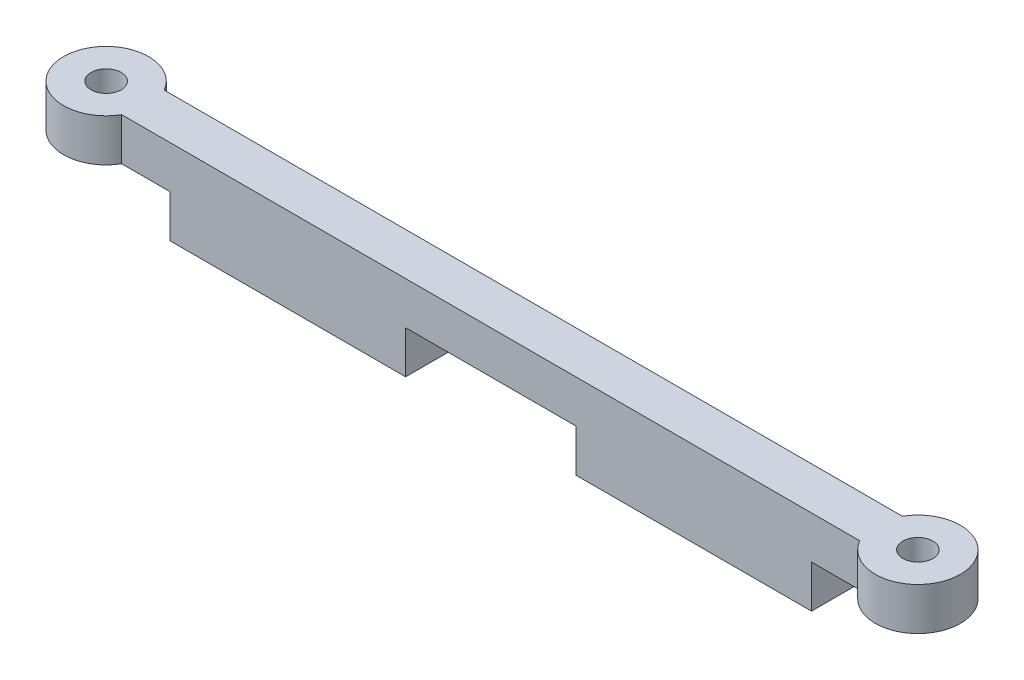
ISO-10303-21;
HEADER;
FILE_DESCRIPTION(('STEP AP214'),'2;1');
FILE_NAME('part.step','',(''),(''),'','','');
FILE_SCHEMA(('AUTOMOTIVE_DESIGN { 1 0 10303 214 1 1 1 1 }'));
ENDSEC;
DATA;
#1=APPLICATION_CONTEXT('core data for automotive mechanical design processes');
#2=APPLICATION_PROTOCOL_DEFINITION('international standard','automotive_design',2000,#1);
#3=PRODUCT_CONTEXT('',#1,'mechanical');
#4=PRODUCT('Part','Part','',(#3));
#5=PRODUCT_RELATED_PRODUCT_CATEGORY('part','',(#4));
#6=PRODUCT_DEFINITION_FORMATION('','',#4);
#7=PRODUCT_DEFINITION_CONTEXT('part definition',#1,'design');
#8=PRODUCT_DEFINITION('design','',#6,#7);
#9=PRODUCT_DEFINITION_SHAPE('','',#8);
#10=(LENGTH_UNIT() NAMED_UNIT(*) SI_UNIT(.MILLI.,.METRE.));
#11=(NAMED_UNIT(*) PLANE_ANGLE_UNIT() SI_UNIT($,.RADIAN.));
#12=(NAMED_UNIT(*) SI_UNIT($,.STERADIAN.) SOLID_ANGLE_UNIT());
#13=UNCERTAINTY_MEASURE_WITH_UNIT(LENGTH_MEASURE(1.E-05),#10,'distance_accuracy_value','');
#14=(GEOMETRIC_REPRESENTATION_CONTEXT(3) GLOBAL_UNCERTAINTY_ASSIGNED_CONTEXT((#13)) GLOBAL_UNIT_ASSIGNED_CONTEXT((#10,
#11,#12)) REPRESENTATION_CONTEXT('',''));
#15=CARTESIAN_POINT('',(0.,0.,0.));
#16=DIRECTION('',(0.,0.,1.));
#17=DIRECTION('',(1.,0.,0.));
#18=AXIS2_PLACEMENT_3D('',#15,#16,#17);
#19=CARTESIAN_POINT('',(0.,0.,0.));
#20=DIRECTION('',(0.,1.,0.));
#21=DIRECTION('',(0.,0.,1.));
#22=AXIS2_PLACEMENT_3D('',#19,#20,#21);
#23=PLANE('',#22);
#24=DIRECTION('',(1.,0.,0.));
#25=VECTOR('',#24,1.);
#26=CARTESIAN_POINT('',(0.,0.,3.175));
#27=LINE('',#26,#25);
#28=CARTESIAN_POINT('',(73.279,0.,3.17500000000001));
#29=VERTEX_POINT('',#28);
#30=CARTESIAN_POINT('',(108.458,0.,3.175));
#31=VERTEX_POINT('',#30);
#32=EDGE_CURVE('E211',#29,#31,#27,.T.);
#33=ORIENTED_EDGE('',*,*,#32,.F.);
#34=DIRECTION('',(0.,0.,1.));
#35=VECTOR('',#34,1.);
#36=CARTESIAN_POINT('',(73.279,0.,3.17500000000001));
#37=LINE('',#36,#35);
#38=CARTESIAN_POINT('',(73.279,0.,-3.17499999999999));
#39=VERTEX_POINT('',#38);
#40=EDGE_CURVE('E138',#39,#29,#37,.T.);
#41=ORIENTED_EDGE('',*,*,#40,.F.);
#42=DIRECTION('',(-1.,0.,0.));
#43=VECTOR('',#42,1.);
#44=CARTESIAN_POINT('',(0.,0.,-3.175));
#45=LINE('',#44,#43);
#46=CARTESIAN_POINT('',(108.458,0.,-3.175));
#47=VERTEX_POINT('',#46);
#48=EDGE_CURVE('E208',#47,#39,#45,.T.);
#49=ORIENTED_EDGE('',*,*,#48,.F.);
#50=DIRECTION('',(0.,0.,-1.));
#51=VECTOR('',#50,1.);
#52=CARTESIAN_POINT('',(108.458,0.,0.));
#53=LINE('',#52,#51);
#54=EDGE_CURVE('E175',#31,#47,#53,.T.);
#55=ORIENTED_EDGE('',*,*,#54,.F.);
#56=EDGE_LOOP('',(#33,#41,#49,#55));
#57=FACE_BOUND('',#56,.T.);
#58=ADVANCED_FACE('F33',(#57),#23,.F.);
#59=CARTESIAN_POINT('',(121.158,12.7,0.));
#60=DIRECTION('',(0.,-1.,0.));
#61=DIRECTION('',(0.,0.,-1.));
#62=AXIS2_PLACEMENT_3D('',#59,#60,#61);
#63=CYLINDRICAL_SURFACE('',#62,6.35);
#64=CARTESIAN_POINT('',(121.158,6.35,0.));
#65=DIRECTION('',(0.,-1.,0.));
#66=DIRECTION('',(0.,0.,-1.));
#67=AXIS2_PLACEMENT_3D('',#64,#65,#66);
#68=CIRCLE('',#67,6.35);
#69=CARTESIAN_POINT('',(115.658738685969,6.35,-3.175));
#70=VERTEX_POINT('',#69);
#71=CARTESIAN_POINT('',(115.658738685969,6.35,3.175));
#72=VERTEX_POINT('',#71);
#73=EDGE_CURVE('E174',#70,#72,#68,.T.);
#74=ORIENTED_EDGE('',*,*,#73,.F.);
#75=DIRECTION('',(0.,-1.,0.));
#76=VECTOR('',#75,1.);
#77=CARTESIAN_POINT('',(115.658738685969,12.7,-3.175));
#78=LINE('',#77,#76);
#79=CARTESIAN_POINT('',(115.658738685969,12.7,-3.175));
#80=VERTEX_POINT('',#79);
#81=EDGE_CURVE('E11',#80,#70,#78,.T.);
#82=ORIENTED_EDGE('',*,*,#81,.F.);
#83=CARTESIAN_POINT('',(121.158,12.7,0.));
#84=DIRECTION('',(0.,1.,0.));
#85=DIRECTION('',(0.,0.,1.));
#86=AXIS2_PLACEMENT_3D('',#83,#84,#85);
#87=CIRCLE('',#86,6.35);
#88=CARTESIAN_POINT('',(115.658738685969,12.7,3.175));
#89=VERTEX_POINT('',#88);
#90=EDGE_CURVE('E195',#89,#80,#87,.T.);
#91=ORIENTED_EDGE('',*,*,#90,.F.);
#92=DIRECTION('',(0.,-1.,0.));
#93=VECTOR('',#92,1.);
#94=CARTESIAN_POINT('',(115.658738685969,12.7,3.175));
#95=LINE('',#94,#93);
#96=EDGE_CURVE('E207',#89,#72,#95,.T.);
#97=ORIENTED_EDGE('',*,*,#96,.T.);
#98=EDGE_LOOP('',(#74,#82,#91,#97));
#99=FACE_BOUND('',#98,.T.);
#100=ADVANCED_FACE('F241',(#99),#63,.T.);
#101=CARTESIAN_POINT('',(0.,12.7,-3.175));
#102=DIRECTION('',(0.,0.,1.));
#103=DIRECTION('',(1.,0.,0.));
#104=AXIS2_PLACEMENT_3D('',#101,#102,#103);
#105=PLANE('',#104);
#106=ORIENTED_EDGE('',*,*,#48,.T.);
#107=DIRECTION('',(0.,-1.,0.));
#108=VECTOR('',#107,1.);
#109=CARTESIAN_POINT('',(73.279,6.35,-3.17499999999999));
#110=LINE('',#109,#108);
#111=CARTESIAN_POINT('',(73.279,6.35,-3.17499999999999));
#112=VERTEX_POINT('',#111);
#113=EDGE_CURVE('E146',#112,#39,#110,.T.);
#114=ORIENTED_EDGE('',*,*,#113,.F.);
#115=DIRECTION('',(1.,0.,0.));
#116=VECTOR('',#115,1.);
#117=CARTESIAN_POINT('',(47.879,6.35,-3.175));
#118=LINE('',#117,#116);
#119=CARTESIAN_POINT('',(47.879,6.35,-3.175));
#120=VERTEX_POINT('',#119);
#121=EDGE_CURVE('E128',#120,#112,#118,.T.);
#122=ORIENTED_EDGE('',*,*,#121,.F.);
#123=DIRECTION('',(0.,-1.,0.));
#124=VECTOR('',#123,1.);
#125=CARTESIAN_POINT('',(47.879,6.35,-3.175));
#126=LINE('',#125,#124);
#127=CARTESIAN_POINT('',(47.879,0.,-3.175));
#128=VERTEX_POINT('',#127);
#129=EDGE_CURVE('E125',#120,#128,#126,.T.);
#130=ORIENTED_EDGE('',*,*,#129,.T.);
#131=CARTESIAN_POINT('',(12.7,0.,-3.175));
#132=VERTEX_POINT('',#131);
#133=EDGE_CURVE('E56',#128,#132,#45,.T.);
#134=ORIENTED_EDGE('',*,*,#133,.T.);
#135=DIRECTION('',(0.,-1.,0.));
#136=VECTOR('',#135,1.);
#137=CARTESIAN_POINT('',(12.7,6.35,-3.175));
#138=LINE('',#137,#136);
#139=CARTESIAN_POINT('',(12.7,6.35,-3.175));
#140=VERTEX_POINT('',#139);
#141=EDGE_CURVE('E164',#140,#132,#138,.T.);
#142=ORIENTED_EDGE('',*,*,#141,.F.);
#143=DIRECTION('',(1.,0.,0.));
#144=VECTOR('',#143,1.);
#145=CARTESIAN_POINT('',(0.,6.35,-3.175));
#146=LINE('',#145,#144);
#147=CARTESIAN_POINT('',(5.49926131403118,6.35,-3.175));
#148=VERTEX_POINT('',#147);
#149=EDGE_CURVE('E156',#148,#140,#146,.T.);
#150=ORIENTED_EDGE('',*,*,#149,.F.);
#151=DIRECTION('',(0.,-1.,0.));
#152=VECTOR('',#151,1.);
#153=CARTESIAN_POINT('',(5.49926131403118,12.7,-3.175));
#154=LINE('',#153,#152);
#155=CARTESIAN_POINT('',(5.49926131403118,12.7,-3.175));
#156=VERTEX_POINT('',#155);
#157=EDGE_CURVE('E41',#156,#148,#154,.T.);
#158=ORIENTED_EDGE('',*,*,#157,.F.);
#159=DIRECTION('',(-1.,0.,0.));
#160=VECTOR('',#159,1.);
#161=CARTESIAN_POINT('',(0.,12.7,-3.175));
#162=LINE('',#161,#160);
#163=EDGE_CURVE('E198',#80,#156,#162,.T.);
#164=ORIENTED_EDGE('',*,*,#163,.F.);
#165=ORIENTED_EDGE('',*,*,#81,.T.);
#166=DIRECTION('',(1.,0.,0.));
#167=VECTOR('',#166,1.);
#168=CARTESIAN_POINT('',(0.,6.35,-3.175));
#169=LINE('',#168,#167);
#170=CARTESIAN_POINT('',(108.458,6.35,-3.175));
#171=VERTEX_POINT('',#170);
#172=EDGE_CURVE('E183',#171,#70,#169,.T.);
#173=ORIENTED_EDGE('',*,*,#172,.F.);
#174=DIRECTION('',(0.,-1.,0.));
#175=VECTOR('',#174,1.);
#176=CARTESIAN_POINT('',(108.458,6.35,-3.175));
#177=LINE('',#176,#175);
#178=EDGE_CURVE('E167',#171,#47,#177,.T.);
#179=ORIENTED_EDGE('',*,*,#178,.T.);
#180=EDGE_LOOP('',(#106,#114,#122,#130,#134,#142,#150,#158,#164,#165,#173,#179));
#181=FACE_BOUND('',#180,.T.);
#182=ADVANCED_FACE('F225',(#181),#105,.F.);
#183=CARTESIAN_POINT('',(0.,12.7,0.));
#184=DIRECTION('',(0.,-1.,0.));
#185=DIRECTION('',(0.,0.,-1.));
#186=AXIS2_PLACEMENT_3D('',#183,#184,#185);
#187=CYLINDRICAL_SURFACE('',#186,6.35);
#188=CARTESIAN_POINT('',(0.,6.35,0.));
#189=DIRECTION('',(0.,-1.,0.));
#190=DIRECTION('',(0.,0.,-1.));
#191=AXIS2_PLACEMENT_3D('',#188,#189,#190);
#192=CIRCLE('',#191,6.35);
#193=CARTESIAN_POINT('',(5.49926131403118,6.35,3.175));
#194=VERTEX_POINT('',#193);
#195=EDGE_CURVE('E153',#194,#148,#192,.T.);
#196=ORIENTED_EDGE('',*,*,#195,.F.);
#197=DIRECTION('',(0.,-1.,0.));
#198=VECTOR('',#197,1.);
#199=CARTESIAN_POINT('',(5.49926131403118,12.7,3.175));
#200=LINE('',#199,#198);
#201=CARTESIAN_POINT('',(5.49926131403118,12.7,3.175));
#202=VERTEX_POINT('',#201);
#203=EDGE_CURVE('E215',#202,#194,#200,.T.);
#204=ORIENTED_EDGE('',*,*,#203,.F.);
#205=CARTESIAN_POINT('',(0.,12.7,0.));
#206=DIRECTION('',(0.,1.,0.));
#207=DIRECTION('',(0.,0.,1.));
#208=AXIS2_PLACEMENT_3D('',#205,#206,#207);
#209=CIRCLE('',#208,6.35);
#210=EDGE_CURVE('E200',#156,#202,#209,.T.);
#211=ORIENTED_EDGE('',*,*,#210,.F.);
#212=ORIENTED_EDGE('',*,*,#157,.T.);
#213=EDGE_LOOP('',(#196,#204,#211,#212));
#214=FACE_BOUND('',#213,.T.);
#215=ADVANCED_FACE('F222',(#214),#187,.T.);
#216=CARTESIAN_POINT('',(0.,12.7,3.175));
#217=DIRECTION('',(0.,0.,-1.));
#218=DIRECTION('',(-1.,0.,0.));
#219=AXIS2_PLACEMENT_3D('',#216,#217,#218);
#220=PLANE('',#219);
#221=DIRECTION('',(-1.,0.,0.));
#222=VECTOR('',#221,1.);
#223=CARTESIAN_POINT('',(47.879,6.35,3.175));
#224=LINE('',#223,#222);
#225=CARTESIAN_POINT('',(73.279,6.35,3.17500000000001));
#226=VERTEX_POINT('',#225);
#227=CARTESIAN_POINT('',(47.879,6.35,3.175));
#228=VERTEX_POINT('',#227);
#229=EDGE_CURVE('E129',#226,#228,#224,.T.);
#230=ORIENTED_EDGE('',*,*,#229,.F.);
#231=DIRECTION('',(0.,-1.,0.));
#232=VECTOR('',#231,1.);
#233=CARTESIAN_POINT('',(73.279,6.35,3.17500000000001));
#234=LINE('',#233,#232);
#235=EDGE_CURVE('E187',#226,#29,#234,.T.);
#236=ORIENTED_EDGE('',*,*,#235,.T.);
#237=ORIENTED_EDGE('',*,*,#32,.T.);
#238=DIRECTION('',(0.,-1.,0.));
#239=VECTOR('',#238,1.);
#240=CARTESIAN_POINT('',(108.458,6.35,3.175));
#241=LINE('',#240,#239);
#242=CARTESIAN_POINT('',(108.458,6.35,3.175));
#243=VERTEX_POINT('',#242);
#244=EDGE_CURVE('E185',#243,#31,#241,.T.);
#245=ORIENTED_EDGE('',*,*,#244,.F.);
#246=DIRECTION('',(-1.,0.,0.));
#247=VECTOR('',#246,1.);
#248=CARTESIAN_POINT('',(0.,6.35,3.175));
#249=LINE('',#248,#247);
#250=EDGE_CURVE('E177',#72,#243,#249,.T.);
#251=ORIENTED_EDGE('',*,*,#250,.F.);
#252=ORIENTED_EDGE('',*,*,#96,.F.);
#253=DIRECTION('',(1.,0.,0.));
#254=VECTOR('',#253,1.);
#255=CARTESIAN_POINT('',(0.,12.7,3.175));
#256=LINE('',#255,#254);
#257=EDGE_CURVE('E202',#202,#89,#256,.T.);
#258=ORIENTED_EDGE('',*,*,#257,.F.);
#259=ORIENTED_EDGE('',*,*,#203,.T.);
#260=DIRECTION('',(-1.,0.,0.));
#261=VECTOR('',#260,1.);
#262=CARTESIAN_POINT('',(0.,6.35,3.175));
#263=LINE('',#262,#261);
#264=CARTESIAN_POINT('',(12.7,6.35,3.175));
#265=VERTEX_POINT('',#264);
#266=EDGE_CURVE('E151',#265,#194,#263,.T.);
#267=ORIENTED_EDGE('',*,*,#266,.F.);
#268=DIRECTION('',(0.,-1.,0.));
#269=VECTOR('',#268,1.);
#270=CARTESIAN_POINT('',(12.7,6.35,3.175));
#271=LINE('',#270,#269);
#272=CARTESIAN_POINT('',(12.7,0.,3.175));
#273=VERTEX_POINT('',#272);
#274=EDGE_CURVE('E168',#265,#273,#271,.T.);
#275=ORIENTED_EDGE('',*,*,#274,.T.);
#276=CARTESIAN_POINT('',(47.879,0.,3.175));
#277=VERTEX_POINT('',#276);
#278=EDGE_CURVE('E144',#273,#277,#27,.T.);
#279=ORIENTED_EDGE('',*,*,#278,.T.);
#280=DIRECTION('',(0.,-1.,0.));
#281=VECTOR('',#280,1.);
#282=CARTESIAN_POINT('',(47.879,6.35,3.175));
#283=LINE('',#282,#281);
#284=EDGE_CURVE('E48',#228,#277,#283,.T.);
#285=ORIENTED_EDGE('',*,*,#284,.F.);
#286=EDGE_LOOP('',(#230,#236,#237,#245,#251,#252,#258,#259,#267,#275,#279,#285));
#287=FACE_BOUND('',#286,.T.);
#288=ADVANCED_FACE('F141',(#287),#220,.F.);
#289=CARTESIAN_POINT('',(121.158,12.7,0.));
#290=DIRECTION('',(0.,-1.,0.));
#291=DIRECTION('',(0.,0.,-1.));
#292=AXIS2_PLACEMENT_3D('',#289,#290,#291);
#293=CYLINDRICAL_SURFACE('',#292,2.2479);
#294=CARTESIAN_POINT('',(121.158,12.7,0.));
#295=DIRECTION('',(0.,1.,0.));
#296=DIRECTION('',(0.,0.,1.));
#297=AXIS2_PLACEMENT_3D('',#294,#295,#296);
#298=CIRCLE('',#297,2.2479);
#299=CARTESIAN_POINT('',(121.158,12.7,2.2479));
#300=VERTEX_POINT('',#299);
#301=EDGE_CURVE('E192',#300,#300,#298,.T.);
#302=ORIENTED_EDGE('',*,*,#301,.T.);
#303=EDGE_LOOP('',(#302));
#304=FACE_BOUND('',#303,.T.);
#305=CARTESIAN_POINT('',(121.158,6.35,0.));
#306=DIRECTION('',(0.,-1.,0.));
#307=DIRECTION('',(0.,0.,-1.));
#308=AXIS2_PLACEMENT_3D('',#305,#306,#307);
#309=CIRCLE('',#308,2.2479);
#310=CARTESIAN_POINT('',(121.158,6.35,-2.2479));
#311=VERTEX_POINT('',#310);
#312=EDGE_CURVE('E171',#311,#311,#309,.F.);
#313=ORIENTED_EDGE('',*,*,#312,.F.);
#314=EDGE_LOOP('',(#313));
#315=FACE_BOUND('',#314,.T.);
#316=ADVANCED_FACE('F35',(#304,#315),#293,.F.);
#317=CARTESIAN_POINT('',(0.,12.7,0.));
#318=DIRECTION('',(0.,-1.,0.));
#319=DIRECTION('',(0.,0.,-1.));
#320=AXIS2_PLACEMENT_3D('',#317,#318,#319);
#321=CYLINDRICAL_SURFACE('',#320,2.2479);
#322=CARTESIAN_POINT('',(0.,12.7,0.));
#323=DIRECTION('',(0.,1.,0.));
#324=DIRECTION('',(0.,0.,1.));
#325=AXIS2_PLACEMENT_3D('',#322,#323,#324);
#326=CIRCLE('',#325,2.2479);
#327=CARTESIAN_POINT('',(0.,12.7,2.2479));
#328=VERTEX_POINT('',#327);
#329=EDGE_CURVE('E204',#328,#328,#326,.T.);
#330=ORIENTED_EDGE('',*,*,#329,.T.);
#331=EDGE_LOOP('',(#330));
#332=FACE_BOUND('',#331,.T.);
#333=CARTESIAN_POINT('',(0.,6.35,0.));
#334=DIRECTION('',(0.,-1.,0.));
#335=DIRECTION('',(0.,0.,-1.));
#336=AXIS2_PLACEMENT_3D('',#333,#334,#335);
#337=CIRCLE('',#336,2.2479);
#338=CARTESIAN_POINT('',(0.,6.35,-2.2479));
#339=VERTEX_POINT('',#338);
#340=EDGE_CURVE('E161',#339,#339,#337,.F.);
#341=ORIENTED_EDGE('',*,*,#340,.F.);
#342=EDGE_LOOP('',(#341));
#343=FACE_BOUND('',#342,.T.);
#344=ADVANCED_FACE('F280',(#332,#343),#321,.F.);
#345=ORIENTED_EDGE('',*,*,#133,.F.);
#346=DIRECTION('',(0.,0.,-1.));
#347=VECTOR('',#346,1.);
#348=CARTESIAN_POINT('',(47.879,0.,3.175));
#349=LINE('',#348,#347);
#350=EDGE_CURVE('E258',#277,#128,#349,.T.);
#351=ORIENTED_EDGE('',*,*,#350,.F.);
#352=ORIENTED_EDGE('',*,*,#278,.F.);
#353=DIRECTION('',(0.,0.,-1.));
#354=VECTOR('',#353,1.);
#355=CARTESIAN_POINT('',(12.7,0.,0.));
#356=LINE('',#355,#354);
#357=EDGE_CURVE('E154',#273,#132,#356,.T.);
#358=ORIENTED_EDGE('',*,*,#357,.T.);
#359=EDGE_LOOP('',(#345,#351,#352,#358));
#360=FACE_BOUND('',#359,.T.);
#361=ADVANCED_FACE('F273',(#360),#23,.F.);
#362=CARTESIAN_POINT('',(0.,12.7,0.));
#363=DIRECTION('',(0.,1.,0.));
#364=DIRECTION('',(0.,0.,1.));
#365=AXIS2_PLACEMENT_3D('',#362,#363,#364);
#366=PLANE('',#365);
#367=ORIENTED_EDGE('',*,*,#301,.F.);
#368=EDGE_LOOP('',(#367));
#369=FACE_BOUND('',#368,.T.);
#370=ORIENTED_EDGE('',*,*,#90,.T.);
#371=ORIENTED_EDGE('',*,*,#163,.T.);
#372=ORIENTED_EDGE('',*,*,#210,.T.);
#373=ORIENTED_EDGE('',*,*,#257,.T.);
#374=EDGE_LOOP('',(#370,#371,#372,#373));
#375=FACE_BOUND('',#374,.T.);
#376=ORIENTED_EDGE('',*,*,#329,.F.);
#377=EDGE_LOOP('',(#376));
#378=FACE_BOUND('',#377,.T.);
#379=ADVANCED_FACE('F236',(#369,#375,#378),#366,.T.);
#380=CARTESIAN_POINT('',(108.458,6.35,0.));
#381=DIRECTION('',(-1.,0.,0.));
#382=DIRECTION('',(0.,0.,1.));
#383=AXIS2_PLACEMENT_3D('',#380,#381,#382);
#384=PLANE('',#383);
#385=ORIENTED_EDGE('',*,*,#54,.T.);
#386=ORIENTED_EDGE('',*,*,#178,.F.);
#387=DIRECTION('',(0.,0.,-1.));
#388=VECTOR('',#387,1.);
#389=CARTESIAN_POINT('',(108.458,6.35,0.));
#390=LINE('',#389,#388);
#391=EDGE_CURVE('E180',#243,#171,#390,.T.);
#392=ORIENTED_EDGE('',*,*,#391,.F.);
#393=ORIENTED_EDGE('',*,*,#244,.T.);
#394=EDGE_LOOP('',(#385,#386,#392,#393));
#395=FACE_BOUND('',#394,.T.);
#396=ADVANCED_FACE('F248',(#395),#384,.F.);
#397=CARTESIAN_POINT('',(0.,6.35,0.));
#398=DIRECTION('',(0.,-1.,0.));
#399=DIRECTION('',(0.,0.,-1.));
#400=AXIS2_PLACEMENT_3D('',#397,#398,#399);
#401=PLANE('',#400);
#402=ORIENTED_EDGE('',*,*,#312,.T.);
#403=EDGE_LOOP('',(#402));
#404=FACE_BOUND('',#403,.T.);
#405=ORIENTED_EDGE('',*,*,#73,.T.);
#406=ORIENTED_EDGE('',*,*,#250,.T.);
#407=ORIENTED_EDGE('',*,*,#391,.T.);
#408=ORIENTED_EDGE('',*,*,#172,.T.);
#409=EDGE_LOOP('',(#405,#406,#407,#408));
#410=FACE_BOUND('',#409,.T.);
#411=ADVANCED_FACE('F245',(#404,#410),#401,.T.);
#412=CARTESIAN_POINT('',(12.7,6.35,0.));
#413=DIRECTION('',(-1.,0.,0.));
#414=DIRECTION('',(0.,0.,1.));
#415=AXIS2_PLACEMENT_3D('',#412,#413,#414);
#416=PLANE('',#415);
#417=ORIENTED_EDGE('',*,*,#357,.F.);
#418=ORIENTED_EDGE('',*,*,#274,.F.);
#419=DIRECTION('',(0.,0.,-1.));
#420=VECTOR('',#419,1.);
#421=CARTESIAN_POINT('',(12.7,6.35,0.));
#422=LINE('',#421,#420);
#423=EDGE_CURVE('E159',#265,#140,#422,.T.);
#424=ORIENTED_EDGE('',*,*,#423,.T.);
#425=ORIENTED_EDGE('',*,*,#141,.T.);
#426=EDGE_LOOP('',(#417,#418,#424,#425));
#427=FACE_BOUND('',#426,.T.);
#428=ADVANCED_FACE('F268',(#427),#416,.T.);
#429=CARTESIAN_POINT('',(0.,6.35,0.));
#430=DIRECTION('',(0.,-1.,0.));
#431=DIRECTION('',(0.,0.,-1.));
#432=AXIS2_PLACEMENT_3D('',#429,#430,#431);
#433=PLANE('',#432);
#434=ORIENTED_EDGE('',*,*,#266,.T.);
#435=ORIENTED_EDGE('',*,*,#195,.T.);
#436=ORIENTED_EDGE('',*,*,#149,.T.);
#437=ORIENTED_EDGE('',*,*,#423,.F.);
#438=EDGE_LOOP('',(#434,#435,#436,#437));
#439=FACE_BOUND('',#438,.T.);
#440=ORIENTED_EDGE('',*,*,#340,.T.);
#441=EDGE_LOOP('',(#440));
#442=FACE_BOUND('',#441,.T.);
#443=ADVANCED_FACE('F228',(#439,#442),#433,.T.);
#444=CARTESIAN_POINT('',(73.279,6.35,3.17500000000001));
#445=DIRECTION('',(1.,0.,0.));
#446=DIRECTION('',(0.,0.,-1.));
#447=AXIS2_PLACEMENT_3D('',#444,#445,#446);
#448=PLANE('',#447);
#449=ORIENTED_EDGE('',*,*,#40,.T.);
#450=ORIENTED_EDGE('',*,*,#235,.F.);
#451=DIRECTION('',(0.,0.,1.));
#452=VECTOR('',#451,1.);
#453=CARTESIAN_POINT('',(73.279,6.35,3.17500000000001));
#454=LINE('',#453,#452);
#455=EDGE_CURVE('E135',#112,#226,#454,.T.);
#456=ORIENTED_EDGE('',*,*,#455,.F.);
#457=ORIENTED_EDGE('',*,*,#113,.T.);
#458=EDGE_LOOP('',(#449,#450,#456,#457));
#459=FACE_BOUND('',#458,.T.);
#460=ADVANCED_FACE('F260',(#459),#448,.F.);
#461=CARTESIAN_POINT('',(47.879,6.35,3.175));
#462=DIRECTION('',(-1.,0.,0.));
#463=DIRECTION('',(0.,0.,1.));
#464=AXIS2_PLACEMENT_3D('',#461,#462,#463);
#465=PLANE('',#464);
#466=ORIENTED_EDGE('',*,*,#350,.T.);
#467=ORIENTED_EDGE('',*,*,#129,.F.);
#468=DIRECTION('',(0.,0.,-1.));
#469=VECTOR('',#468,1.);
#470=CARTESIAN_POINT('',(47.879,6.35,3.175));
#471=LINE('',#470,#469);
#472=EDGE_CURVE('E122',#228,#120,#471,.T.);
#473=ORIENTED_EDGE('',*,*,#472,.F.);
#474=ORIENTED_EDGE('',*,*,#284,.T.);
#475=EDGE_LOOP('',(#466,#467,#473,#474));
#476=FACE_BOUND('',#475,.T.);
#477=ADVANCED_FACE('F124',(#476),#465,.F.);
#478=CARTESIAN_POINT('',(0.,6.35,0.));
#479=DIRECTION('',(0.,1.,0.));
#480=DIRECTION('',(0.,0.,1.));
#481=AXIS2_PLACEMENT_3D('',#478,#479,#480);
#482=PLANE('',#481);
#483=ORIENTED_EDGE('',*,*,#229,.T.);
#484=ORIENTED_EDGE('',*,*,#472,.T.);
#485=ORIENTED_EDGE('',*,*,#121,.T.);
#486=ORIENTED_EDGE('',*,*,#455,.T.);
#487=EDGE_LOOP('',(#483,#484,#485,#486));
#488=FACE_BOUND('',#487,.T.);
#489=ADVANCED_FACE('F133',(#488),#482,.F.);
#490=CLOSED_SHELL('',(#58,#100,#182,#215,#288,#316,#344,#361,#379,#396,#411,#428,#443,#460,#477,#489));
#491=MANIFOLD_SOLID_BREP('B2',#490);
#492=ADVANCED_BREP_SHAPE_REPRESENTATION('',(#18,#491),#14);
#493=SHAPE_DEFINITION_REPRESENTATION(#9,#492);
ENDSEC;
END-ISO-10303-21;
